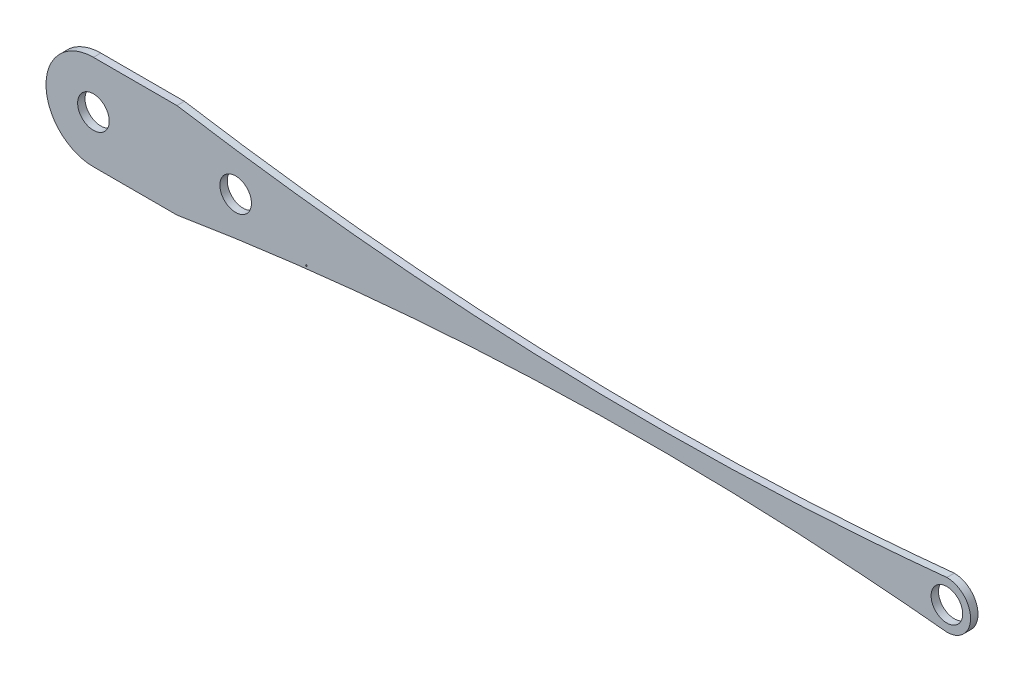
ISO-10303-21;
HEADER;
FILE_DESCRIPTION(('STEP AP214'),'2;1');
FILE_NAME('part.step','',(''),(''),'','','');
FILE_SCHEMA(('AUTOMOTIVE_DESIGN { 1 0 10303 214 1 1 1 1 }'));
ENDSEC;
DATA;
#1=APPLICATION_CONTEXT('core data for automotive mechanical design processes');
#2=APPLICATION_PROTOCOL_DEFINITION('international standard','automotive_design',2000,#1);
#3=PRODUCT_CONTEXT('',#1,'mechanical');
#4=PRODUCT('Part','Part','',(#3));
#5=PRODUCT_RELATED_PRODUCT_CATEGORY('part','',(#4));
#6=PRODUCT_DEFINITION_FORMATION('','',#4);
#7=PRODUCT_DEFINITION_CONTEXT('part definition',#1,'design');
#8=PRODUCT_DEFINITION('design','',#6,#7);
#9=PRODUCT_DEFINITION_SHAPE('','',#8);
#10=(LENGTH_UNIT() NAMED_UNIT(*) SI_UNIT(.MILLI.,.METRE.));
#11=(NAMED_UNIT(*) PLANE_ANGLE_UNIT() SI_UNIT($,.RADIAN.));
#12=(NAMED_UNIT(*) SI_UNIT($,.STERADIAN.) SOLID_ANGLE_UNIT());
#13=UNCERTAINTY_MEASURE_WITH_UNIT(LENGTH_MEASURE(1.E-05),#10,'distance_accuracy_value','');
#14=(GEOMETRIC_REPRESENTATION_CONTEXT(3) GLOBAL_UNCERTAINTY_ASSIGNED_CONTEXT((#13)) GLOBAL_UNIT_ASSIGNED_CONTEXT((#10,
#11,#12)) REPRESENTATION_CONTEXT('',''));
#15=CARTESIAN_POINT('',(0.,0.,0.));
#16=DIRECTION('',(0.,0.,1.));
#17=DIRECTION('',(1.,0.,0.));
#18=AXIS2_PLACEMENT_3D('',#15,#16,#17);
#19=CARTESIAN_POINT('',(39.3781943628449,-19.05,3.47265625));
#20=DIRECTION('',(0.,1.,0.));
#21=DIRECTION('',(0.,0.,1.));
#22=AXIS2_PLACEMENT_3D('',#19,#20,#21);
#23=PLANE('',#22);
#24=DIRECTION('',(1.,0.,0.));
#25=VECTOR('',#24,1.);
#26=CARTESIAN_POINT('',(39.3781943628449,-19.05,0.49609375));
#27=LINE('',#26,#25);
#28=CARTESIAN_POINT('',(39.3781943628449,-19.05,0.49609375));
#29=VERTEX_POINT('',#28);
#30=CARTESIAN_POINT('',(72.9349122773701,-19.05,0.49609375));
#31=VERTEX_POINT('',#30);
#32=EDGE_CURVE('E137',#29,#31,#27,.T.);
#33=ORIENTED_EDGE('',*,*,#32,.T.);
#34=DIRECTION('',(0.,0.,-1.));
#35=VECTOR('',#34,1.);
#36=CARTESIAN_POINT('',(72.9349122773701,-19.05,3.47265625));
#37=LINE('',#36,#35);
#38=CARTESIAN_POINT('',(72.9349122773701,-19.05,3.47265625));
#39=VERTEX_POINT('',#38);
#40=EDGE_CURVE('E11',#39,#31,#37,.T.);
#41=ORIENTED_EDGE('',*,*,#40,.F.);
#42=DIRECTION('',(1.,0.,0.));
#43=VECTOR('',#42,1.);
#44=CARTESIAN_POINT('',(39.3781943628449,-19.05,3.47265625));
#45=LINE('',#44,#43);
#46=CARTESIAN_POINT('',(39.3781943628449,-19.05,3.47265625));
#47=VERTEX_POINT('',#46);
#48=EDGE_CURVE('E172',#47,#39,#45,.T.);
#49=ORIENTED_EDGE('',*,*,#48,.F.);
#50=DIRECTION('',(0.,0.,-1.));
#51=VECTOR('',#50,1.);
#52=CARTESIAN_POINT('',(39.3781943628449,-19.05,3.47265625));
#53=LINE('',#52,#51);
#54=EDGE_CURVE('E120',#47,#29,#53,.T.);
#55=ORIENTED_EDGE('',*,*,#54,.T.);
#56=EDGE_LOOP('',(#33,#41,#49,#55));
#57=FACE_BOUND('',#56,.T.);
#58=ADVANCED_FACE('F41',(#57),#23,.F.);
#59=CARTESIAN_POINT('',(72.9349122773701,-19.05,3.47265625));
#60=CARTESIAN_POINT('',(226.840584346998,6.00050707489058,3.47265625));
#61=CARTESIAN_POINT('',(382.278194362845,-9.525,3.47265625));
#62=B_SPLINE_CURVE_WITH_KNOTS('',2,(#59,#60,#61),.UNSPECIFIED.,.F.,.F.,(3,3),(0.,1.),.UNSPECIFIED.);
#63=DIRECTION('',(0.,0.,-1.));
#64=VECTOR('',#63,1.);
#65=SURFACE_OF_LINEAR_EXTRUSION('',#62,#64);
#66=CARTESIAN_POINT('',(72.9349122773701,-19.05,0.49609375));
#67=CARTESIAN_POINT('',(226.840584346998,6.00050707489058,0.49609375));
#68=CARTESIAN_POINT('',(382.278194362845,-9.525,0.49609375));
#69=B_SPLINE_CURVE_WITH_KNOTS('',2,(#66,#67,#68),.UNSPECIFIED.,.F.,.F.,(3,3),(0.,1.),.UNSPECIFIED.);
#70=CARTESIAN_POINT('',(382.278194362845,-9.525,0.49609375));
#71=VERTEX_POINT('',#70);
#72=EDGE_CURVE('E140',#31,#71,#69,.T.);
#73=ORIENTED_EDGE('',*,*,#72,.T.);
#74=DIRECTION('',(0.,0.,-1.));
#75=VECTOR('',#74,1.);
#76=CARTESIAN_POINT('',(382.278194362845,-9.525,3.47265625));
#77=LINE('',#76,#75);
#78=CARTESIAN_POINT('',(382.278194362845,-9.525,3.47265625));
#79=VERTEX_POINT('',#78);
#80=EDGE_CURVE('E50',#79,#71,#77,.T.);
#81=ORIENTED_EDGE('',*,*,#80,.F.);
#82=EDGE_CURVE('E91',#39,#79,#62,.T.);
#83=ORIENTED_EDGE('',*,*,#82,.F.);
#84=ORIENTED_EDGE('',*,*,#40,.T.);
#85=EDGE_LOOP('',(#73,#81,#83,#84));
#86=FACE_BOUND('',#85,.T.);
#87=ADVANCED_FACE('F188',(#86),#65,.F.);
#88=CARTESIAN_POINT('',(382.278194362845,0.,3.47265625));
#89=DIRECTION('',(0.,0.,-1.));
#90=DIRECTION('',(-1.,0.,0.));
#91=AXIS2_PLACEMENT_3D('',#88,#89,#90);
#92=CYLINDRICAL_SURFACE('',#91,9.525);
#93=CARTESIAN_POINT('',(382.278194362845,0.,0.49609375));
#94=DIRECTION('',(0.,0.,1.));
#95=DIRECTION('',(1.,0.,0.));
#96=AXIS2_PLACEMENT_3D('',#93,#94,#95);
#97=CIRCLE('',#96,9.525);
#98=CARTESIAN_POINT('',(382.278194362845,9.525,0.49609375));
#99=VERTEX_POINT('',#98);
#100=EDGE_CURVE('E144',#71,#99,#97,.T.);
#101=ORIENTED_EDGE('',*,*,#100,.T.);
#102=DIRECTION('',(0.,0.,-1.));
#103=VECTOR('',#102,1.);
#104=CARTESIAN_POINT('',(382.278194362845,9.525,3.47265625));
#105=LINE('',#104,#103);
#106=CARTESIAN_POINT('',(382.278194362845,9.525,3.47265625));
#107=VERTEX_POINT('',#106);
#108=EDGE_CURVE('E110',#107,#99,#105,.T.);
#109=ORIENTED_EDGE('',*,*,#108,.F.);
#110=CARTESIAN_POINT('',(382.278194362845,0.,3.47265625));
#111=DIRECTION('',(0.,0.,1.));
#112=DIRECTION('',(1.,0.,0.));
#113=AXIS2_PLACEMENT_3D('',#110,#111,#112);
#114=CIRCLE('',#113,9.525);
#115=EDGE_CURVE('E115',#79,#107,#114,.T.);
#116=ORIENTED_EDGE('',*,*,#115,.F.);
#117=ORIENTED_EDGE('',*,*,#80,.T.);
#118=EDGE_LOOP('',(#101,#109,#116,#117));
#119=FACE_BOUND('',#118,.T.);
#120=ADVANCED_FACE('F165',(#119),#92,.T.);
#121=CARTESIAN_POINT('',(72.9349122773701,19.05,3.47265625));
#122=CARTESIAN_POINT('',(226.840584346998,-6.00050707489058,3.47265625));
#123=CARTESIAN_POINT('',(382.278194362845,9.525,3.47265625));
#124=B_SPLINE_CURVE_WITH_KNOTS('',2,(#121,#122,#123),.UNSPECIFIED.,.F.,.F.,(3,3),(0.,1.),.UNSPECIFIED.);
#125=DIRECTION('',(0.,0.,-1.));
#126=VECTOR('',#125,1.);
#127=SURFACE_OF_LINEAR_EXTRUSION('',#124,#126);
#128=CARTESIAN_POINT('',(72.9349122773701,19.05,0.49609375));
#129=CARTESIAN_POINT('',(226.840584346998,-6.00050707489058,0.49609375));
#130=CARTESIAN_POINT('',(382.278194362845,9.525,0.49609375));
#131=B_SPLINE_CURVE_WITH_KNOTS('',2,(#128,#129,#130),.UNSPECIFIED.,.F.,.F.,(3,3),(0.,1.),.UNSPECIFIED.);
#132=CARTESIAN_POINT('',(72.9349122773701,19.05,0.49609375));
#133=VERTEX_POINT('',#132);
#134=EDGE_CURVE('E105',#133,#99,#131,.T.);
#135=ORIENTED_EDGE('',*,*,#134,.F.);
#136=DIRECTION('',(0.,0.,-1.));
#137=VECTOR('',#136,1.);
#138=CARTESIAN_POINT('',(72.9349122773701,19.05,3.47265625));
#139=LINE('',#138,#137);
#140=CARTESIAN_POINT('',(72.9349122773701,19.05,3.47265625));
#141=VERTEX_POINT('',#140);
#142=EDGE_CURVE('E100',#141,#133,#139,.T.);
#143=ORIENTED_EDGE('',*,*,#142,.F.);
#144=EDGE_CURVE('E103',#141,#107,#124,.T.);
#145=ORIENTED_EDGE('',*,*,#144,.T.);
#146=ORIENTED_EDGE('',*,*,#108,.T.);
#147=EDGE_LOOP('',(#135,#143,#145,#146));
#148=FACE_BOUND('',#147,.T.);
#149=ADVANCED_FACE('F102',(#148),#127,.T.);
#150=CARTESIAN_POINT('',(39.3781943628449,19.05,3.47265625));
#151=DIRECTION('',(0.,1.,0.));
#152=DIRECTION('',(0.,0.,1.));
#153=AXIS2_PLACEMENT_3D('',#150,#151,#152);
#154=PLANE('',#153);
#155=DIRECTION('',(1.,0.,0.));
#156=VECTOR('',#155,1.);
#157=CARTESIAN_POINT('',(39.3781943628449,19.05,0.49609375));
#158=LINE('',#157,#156);
#159=CARTESIAN_POINT('',(39.3781943628449,19.05,0.49609375));
#160=VERTEX_POINT('',#159);
#161=EDGE_CURVE('E153',#160,#133,#158,.T.);
#162=ORIENTED_EDGE('',*,*,#161,.F.);
#163=DIRECTION('',(0.,0.,-1.));
#164=VECTOR('',#163,1.);
#165=CARTESIAN_POINT('',(39.3781943628449,19.05,3.47265625));
#166=LINE('',#165,#164);
#167=CARTESIAN_POINT('',(39.3781943628449,19.05,3.47265625));
#168=VERTEX_POINT('',#167);
#169=EDGE_CURVE('E80',#168,#160,#166,.T.);
#170=ORIENTED_EDGE('',*,*,#169,.F.);
#171=DIRECTION('',(1.,0.,0.));
#172=VECTOR('',#171,1.);
#173=CARTESIAN_POINT('',(39.3781943628449,19.05,3.47265625));
#174=LINE('',#173,#172);
#175=EDGE_CURVE('E113',#168,#141,#174,.T.);
#176=ORIENTED_EDGE('',*,*,#175,.T.);
#177=ORIENTED_EDGE('',*,*,#142,.T.);
#178=EDGE_LOOP('',(#162,#170,#176,#177));
#179=FACE_BOUND('',#178,.T.);
#180=ADVANCED_FACE('F118',(#179),#154,.T.);
#181=CARTESIAN_POINT('',(39.3781943628449,0.,3.47265625));
#182=DIRECTION('',(0.,0.,-1.));
#183=DIRECTION('',(-1.,0.,0.));
#184=AXIS2_PLACEMENT_3D('',#181,#182,#183);
#185=CYLINDRICAL_SURFACE('',#184,6.35);
#186=CARTESIAN_POINT('',(39.3781943628449,0.,3.47265625));
#187=DIRECTION('',(0.,0.,1.));
#188=DIRECTION('',(1.,0.,0.));
#189=AXIS2_PLACEMENT_3D('',#186,#187,#188);
#190=CIRCLE('',#189,6.35);
#191=CARTESIAN_POINT('',(45.7281943628449,0.,3.47265625));
#192=VERTEX_POINT('',#191);
#193=EDGE_CURVE('E235',#192,#192,#190,.T.);
#194=ORIENTED_EDGE('',*,*,#193,.T.);
#195=EDGE_LOOP('',(#194));
#196=FACE_BOUND('',#195,.T.);
#197=CARTESIAN_POINT('',(39.3781943628449,0.,0.49609375));
#198=DIRECTION('',(0.,0.,1.));
#199=DIRECTION('',(1.,0.,0.));
#200=AXIS2_PLACEMENT_3D('',#197,#198,#199);
#201=CIRCLE('',#200,6.35);
#202=CARTESIAN_POINT('',(45.7281943628449,0.,0.49609375));
#203=VERTEX_POINT('',#202);
#204=EDGE_CURVE('E134',#203,#203,#201,.T.);
#205=ORIENTED_EDGE('',*,*,#204,.F.);
#206=EDGE_LOOP('',(#205));
#207=FACE_BOUND('',#206,.T.);
#208=ADVANCED_FACE('F197',(#196,#207),#185,.F.);
#209=CARTESIAN_POINT('',(382.278194362845,0.,3.47265625));
#210=DIRECTION('',(0.,0.,-1.));
#211=DIRECTION('',(-1.,0.,0.));
#212=AXIS2_PLACEMENT_3D('',#209,#210,#211);
#213=CYLINDRICAL_SURFACE('',#212,6.35);
#214=CARTESIAN_POINT('',(382.278194362845,0.,3.47265625));
#215=DIRECTION('',(0.,0.,1.));
#216=DIRECTION('',(1.,0.,0.));
#217=AXIS2_PLACEMENT_3D('',#214,#215,#216);
#218=CIRCLE('',#217,6.35);
#219=CARTESIAN_POINT('',(388.628194362845,0.,3.47265625));
#220=VERTEX_POINT('',#219);
#221=EDGE_CURVE('E207',#220,#220,#218,.T.);
#222=ORIENTED_EDGE('',*,*,#221,.T.);
#223=EDGE_LOOP('',(#222));
#224=FACE_BOUND('',#223,.T.);
#225=CARTESIAN_POINT('',(382.278194362845,0.,0.49609375));
#226=DIRECTION('',(0.,0.,1.));
#227=DIRECTION('',(1.,0.,0.));
#228=AXIS2_PLACEMENT_3D('',#225,#226,#227);
#229=CIRCLE('',#228,6.35);
#230=CARTESIAN_POINT('',(388.628194362845,0.,0.49609375));
#231=VERTEX_POINT('',#230);
#232=EDGE_CURVE('E130',#231,#231,#229,.T.);
#233=ORIENTED_EDGE('',*,*,#232,.F.);
#234=EDGE_LOOP('',(#233));
#235=FACE_BOUND('',#234,.T.);
#236=ADVANCED_FACE('F183',(#224,#235),#213,.F.);
#237=CARTESIAN_POINT('',(96.5281943628449,0.,3.47265625));
#238=DIRECTION('',(0.,0.,-1.));
#239=DIRECTION('',(-1.,0.,0.));
#240=AXIS2_PLACEMENT_3D('',#237,#238,#239);
#241=CYLINDRICAL_SURFACE('',#240,6.35);
#242=CARTESIAN_POINT('',(96.5281943628449,0.,3.47265625));
#243=DIRECTION('',(0.,0.,1.));
#244=DIRECTION('',(1.,0.,0.));
#245=AXIS2_PLACEMENT_3D('',#242,#243,#244);
#246=CIRCLE('',#245,6.35);
#247=CARTESIAN_POINT('',(102.878194362845,0.,3.47265625));
#248=VERTEX_POINT('',#247);
#249=EDGE_CURVE('E159',#248,#248,#246,.T.);
#250=ORIENTED_EDGE('',*,*,#249,.T.);
#251=EDGE_LOOP('',(#250));
#252=FACE_BOUND('',#251,.T.);
#253=CARTESIAN_POINT('',(96.5281943628449,0.,0.49609375));
#254=DIRECTION('',(0.,0.,1.));
#255=DIRECTION('',(1.,0.,0.));
#256=AXIS2_PLACEMENT_3D('',#253,#254,#255);
#257=CIRCLE('',#256,6.35);
#258=CARTESIAN_POINT('',(102.878194362845,0.,0.49609375));
#259=VERTEX_POINT('',#258);
#260=EDGE_CURVE('E127',#259,#259,#257,.T.);
#261=ORIENTED_EDGE('',*,*,#260,.F.);
#262=EDGE_LOOP('',(#261));
#263=FACE_BOUND('',#262,.T.);
#264=ADVANCED_FACE('F43',(#252,#263),#241,.F.);
#265=CARTESIAN_POINT('',(39.3781943628449,0.,3.47265625));
#266=DIRECTION('',(0.,0.,-1.));
#267=DIRECTION('',(-1.,0.,0.));
#268=AXIS2_PLACEMENT_3D('',#265,#266,#267);
#269=CYLINDRICAL_SURFACE('',#268,19.05);
#270=CARTESIAN_POINT('',(39.3781943628449,0.,0.49609375));
#271=DIRECTION('',(0.,0.,1.));
#272=DIRECTION('',(1.,0.,0.));
#273=AXIS2_PLACEMENT_3D('',#270,#271,#272);
#274=CIRCLE('',#273,19.05);
#275=EDGE_CURVE('E83',#160,#29,#274,.T.);
#276=ORIENTED_EDGE('',*,*,#275,.T.);
#277=ORIENTED_EDGE('',*,*,#54,.F.);
#278=CARTESIAN_POINT('',(39.3781943628449,0.,3.47265625));
#279=DIRECTION('',(0.,0.,1.));
#280=DIRECTION('',(1.,0.,0.));
#281=AXIS2_PLACEMENT_3D('',#278,#279,#280);
#282=CIRCLE('',#281,19.05);
#283=EDGE_CURVE('E58',#168,#47,#282,.T.);
#284=ORIENTED_EDGE('',*,*,#283,.F.);
#285=ORIENTED_EDGE('',*,*,#169,.T.);
#286=EDGE_LOOP('',(#276,#277,#284,#285));
#287=FACE_BOUND('',#286,.T.);
#288=ADVANCED_FACE('F173',(#287),#269,.T.);
#289=CARTESIAN_POINT('',(39.3781943628449,0.,3.47265625));
#290=DIRECTION('',(0.,0.,1.));
#291=DIRECTION('',(1.,0.,0.));
#292=AXIS2_PLACEMENT_3D('',#289,#290,#291);
#293=PLANE('',#292);
#294=CARTESIAN_POINT('',(124.940154127565,-10.644547609971,3.47265625));
#295=DIRECTION('',(0.,0.,1.));
#296=DIRECTION('',(1.,0.,0.));
#297=AXIS2_PLACEMENT_3D('',#294,#295,#296);
#298=CIRCLE('',#297,0.285749999999991);
#299=CARTESIAN_POINT('',(125.225904127565,-10.644547609971,3.47265625));
#300=VERTEX_POINT('',#299);
#301=EDGE_CURVE('E227',#300,#300,#298,.T.);
#302=ORIENTED_EDGE('',*,*,#301,.F.);
#303=EDGE_LOOP('',(#302));
#304=FACE_BOUND('',#303,.T.);
#305=ORIENTED_EDGE('',*,*,#249,.F.);
#306=EDGE_LOOP('',(#305));
#307=FACE_BOUND('',#306,.T.);
#308=ORIENTED_EDGE('',*,*,#221,.F.);
#309=EDGE_LOOP('',(#308));
#310=FACE_BOUND('',#309,.T.);
#311=ORIENTED_EDGE('',*,*,#193,.F.);
#312=EDGE_LOOP('',(#311));
#313=FACE_BOUND('',#312,.T.);
#314=ORIENTED_EDGE('',*,*,#48,.T.);
#315=ORIENTED_EDGE('',*,*,#82,.T.);
#316=ORIENTED_EDGE('',*,*,#115,.T.);
#317=ORIENTED_EDGE('',*,*,#144,.F.);
#318=ORIENTED_EDGE('',*,*,#175,.F.);
#319=ORIENTED_EDGE('',*,*,#283,.T.);
#320=EDGE_LOOP('',(#314,#315,#316,#317,#318,#319));
#321=FACE_BOUND('',#320,.T.);
#322=ADVANCED_FACE('F112',(#304,#307,#310,#313,#321),#293,.T.);
#323=CARTESIAN_POINT('',(39.3781943628449,0.,0.49609375));
#324=DIRECTION('',(0.,0.,1.));
#325=DIRECTION('',(1.,0.,0.));
#326=AXIS2_PLACEMENT_3D('',#323,#324,#325);
#327=PLANE('',#326);
#328=CARTESIAN_POINT('',(124.940154127565,-10.644547609971,0.49609375));
#329=DIRECTION('',(0.,0.,1.));
#330=DIRECTION('',(1.,0.,0.));
#331=AXIS2_PLACEMENT_3D('',#328,#329,#330);
#332=CIRCLE('',#331,0.285749999999991);
#333=CARTESIAN_POINT('',(125.225904127565,-10.644547609971,0.49609375));
#334=VERTEX_POINT('',#333);
#335=EDGE_CURVE('E131',#334,#334,#332,.T.);
#336=ORIENTED_EDGE('',*,*,#335,.T.);
#337=EDGE_LOOP('',(#336));
#338=FACE_BOUND('',#337,.T.);
#339=ORIENTED_EDGE('',*,*,#260,.T.);
#340=EDGE_LOOP('',(#339));
#341=FACE_BOUND('',#340,.T.);
#342=ORIENTED_EDGE('',*,*,#232,.T.);
#343=EDGE_LOOP('',(#342));
#344=FACE_BOUND('',#343,.T.);
#345=ORIENTED_EDGE('',*,*,#204,.T.);
#346=EDGE_LOOP('',(#345));
#347=FACE_BOUND('',#346,.T.);
#348=ORIENTED_EDGE('',*,*,#32,.F.);
#349=ORIENTED_EDGE('',*,*,#275,.F.);
#350=ORIENTED_EDGE('',*,*,#161,.T.);
#351=ORIENTED_EDGE('',*,*,#134,.T.);
#352=ORIENTED_EDGE('',*,*,#100,.F.);
#353=ORIENTED_EDGE('',*,*,#72,.F.);
#354=EDGE_LOOP('',(#348,#349,#350,#351,#352,#353));
#355=FACE_BOUND('',#354,.T.);
#356=ADVANCED_FACE('F168',(#338,#341,#344,#347,#355),#327,.F.);
#357=CARTESIAN_POINT('',(124.940154127565,-10.644547609971,0.49609375));
#358=DIRECTION('',(0.,0.,1.));
#359=DIRECTION('',(1.,0.,0.));
#360=AXIS2_PLACEMENT_3D('',#357,#358,#359);
#361=CYLINDRICAL_SURFACE('',#360,0.285749999999991);
#362=ORIENTED_EDGE('',*,*,#335,.F.);
#363=EDGE_LOOP('',(#362));
#364=FACE_BOUND('',#363,.T.);
#365=ORIENTED_EDGE('',*,*,#301,.T.);
#366=EDGE_LOOP('',(#365));
#367=FACE_BOUND('',#366,.T.);
#368=ADVANCED_FACE('F212',(#364,#367),#361,.F.);
#369=CLOSED_SHELL('',(#58,#87,#120,#149,#180,#208,#236,#264,#288,#322,#356,#368));
#370=MANIFOLD_SOLID_BREP('B2',#369);
#371=ADVANCED_BREP_SHAPE_REPRESENTATION('',(#18,#370),#14);
#372=SHAPE_DEFINITION_REPRESENTATION(#9,#371);
ENDSEC;
END-ISO-10303-21;
